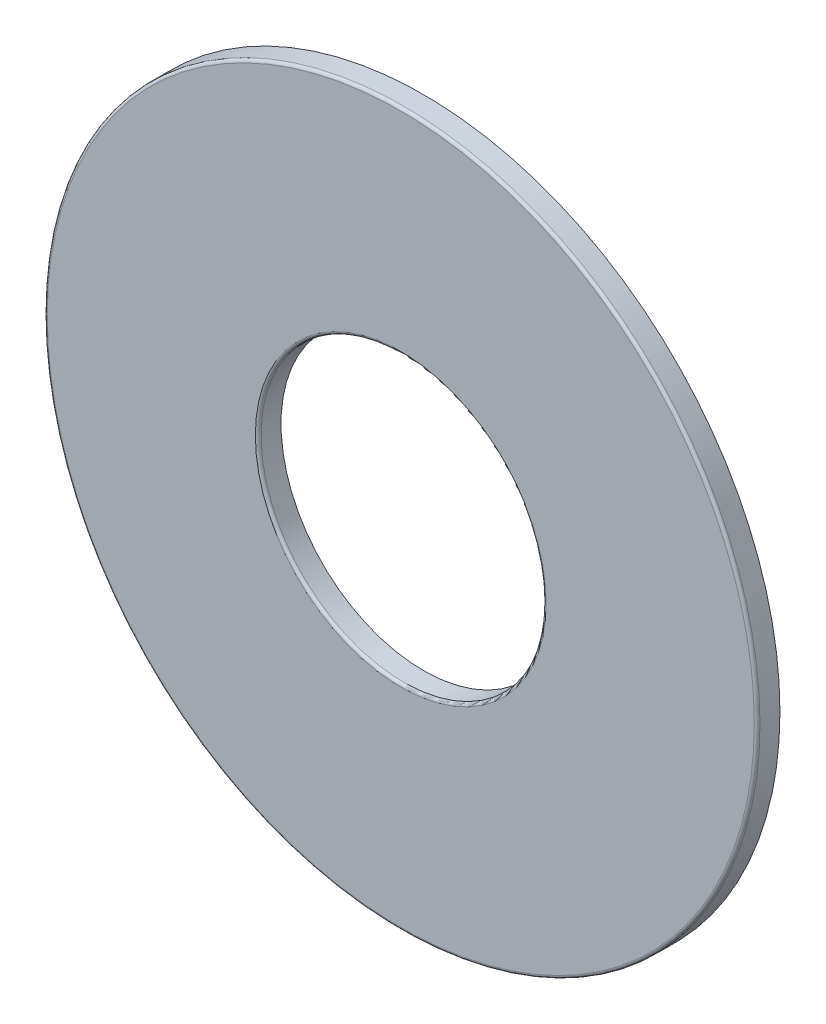
ISO-10303-21;
HEADER;
FILE_DESCRIPTION(('STEP AP214'),'2;1');
FILE_NAME('part.step','',(''),(''),'','','');
FILE_SCHEMA(('AUTOMOTIVE_DESIGN { 1 0 10303 214 1 1 1 1 }'));
ENDSEC;
DATA;
#1=APPLICATION_CONTEXT('core data for automotive mechanical design processes');
#2=APPLICATION_PROTOCOL_DEFINITION('international standard','automotive_design',2000,#1);
#3=PRODUCT_CONTEXT('',#1,'mechanical');
#4=PRODUCT('Part','Part','',(#3));
#5=PRODUCT_RELATED_PRODUCT_CATEGORY('part','',(#4));
#6=PRODUCT_DEFINITION_FORMATION('','',#4);
#7=PRODUCT_DEFINITION_CONTEXT('part definition',#1,'design');
#8=PRODUCT_DEFINITION('design','',#6,#7);
#9=PRODUCT_DEFINITION_SHAPE('','',#8);
#10=(LENGTH_UNIT() NAMED_UNIT(*) SI_UNIT(.MILLI.,.METRE.));
#11=(NAMED_UNIT(*) PLANE_ANGLE_UNIT() SI_UNIT($,.RADIAN.));
#12=(NAMED_UNIT(*) SI_UNIT($,.STERADIAN.) SOLID_ANGLE_UNIT());
#13=UNCERTAINTY_MEASURE_WITH_UNIT(LENGTH_MEASURE(1.E-05),#10,'distance_accuracy_value','');
#14=(GEOMETRIC_REPRESENTATION_CONTEXT(3) GLOBAL_UNCERTAINTY_ASSIGNED_CONTEXT((#13)) GLOBAL_UNIT_ASSIGNED_CONTEXT((#10,
#11,#12)) REPRESENTATION_CONTEXT('',''));
#15=CARTESIAN_POINT('',(0.,0.,0.));
#16=DIRECTION('',(0.,0.,1.));
#17=DIRECTION('',(1.,0.,0.));
#18=AXIS2_PLACEMENT_3D('',#15,#16,#17);
#19=CARTESIAN_POINT('',(0.,0.,0.8));
#20=DIRECTION('',(0.,0.,1.));
#21=DIRECTION('',(1.,0.,0.));
#22=AXIS2_PLACEMENT_3D('',#19,#20,#21);
#23=PLANE('',#22);
#24=CARTESIAN_POINT('',(0.,0.,0.8));
#25=DIRECTION('',(0.,0.,1.));
#26=DIRECTION('',(1.,0.,0.));
#27=AXIS2_PLACEMENT_3D('',#24,#25,#26);
#28=CIRCLE('',#27,12.4);
#29=CARTESIAN_POINT('',(12.4,0.,0.8));
#30=VERTEX_POINT('',#29);
#31=EDGE_CURVE('E42',#30,#30,#28,.T.);
#32=ORIENTED_EDGE('',*,*,#31,.T.);
#33=EDGE_LOOP('',(#32));
#34=FACE_BOUND('',#33,.T.);
#35=CARTESIAN_POINT('',(0.,0.,0.8));
#36=DIRECTION('',(0.,0.,1.));
#37=DIRECTION('',(1.,0.,0.));
#38=AXIS2_PLACEMENT_3D('',#35,#36,#37);
#39=CIRCLE('',#38,5.1);
#40=CARTESIAN_POINT('',(5.1,0.,0.8));
#41=VERTEX_POINT('',#40);
#42=EDGE_CURVE('E46',#41,#41,#39,.F.);
#43=ORIENTED_EDGE('',*,*,#42,.T.);
#44=EDGE_LOOP('',(#43));
#45=FACE_BOUND('',#44,.T.);
#46=ADVANCED_FACE('F31',(#34,#45),#23,.T.);
#47=CARTESIAN_POINT('',(0.,0.,0.));
#48=DIRECTION('',(0.,0.,1.));
#49=DIRECTION('',(1.,0.,0.));
#50=AXIS2_PLACEMENT_3D('',#47,#48,#49);
#51=PLANE('',#50);
#52=CARTESIAN_POINT('',(0.,0.,0.));
#53=DIRECTION('',(0.,0.,1.));
#54=DIRECTION('',(1.,0.,0.));
#55=AXIS2_PLACEMENT_3D('',#52,#53,#54);
#56=CIRCLE('',#55,12.5);
#57=CARTESIAN_POINT('',(12.5,0.,0.));
#58=VERTEX_POINT('',#57);
#59=EDGE_CURVE('E51',#58,#58,#56,.T.);
#60=ORIENTED_EDGE('',*,*,#59,.F.);
#61=EDGE_LOOP('',(#60));
#62=FACE_BOUND('',#61,.T.);
#63=CARTESIAN_POINT('',(0.,0.,0.));
#64=DIRECTION('',(0.,0.,1.));
#65=DIRECTION('',(1.,0.,0.));
#66=AXIS2_PLACEMENT_3D('',#63,#64,#65);
#67=CIRCLE('',#66,5.);
#68=CARTESIAN_POINT('',(5.,0.,0.));
#69=VERTEX_POINT('',#68);
#70=EDGE_CURVE('E54',#69,#69,#67,.T.);
#71=ORIENTED_EDGE('',*,*,#70,.T.);
#72=EDGE_LOOP('',(#71));
#73=FACE_BOUND('',#72,.T.);
#74=ADVANCED_FACE('F58',(#62,#73),#51,.F.);
#75=CARTESIAN_POINT('',(0.,0.,0.8));
#76=DIRECTION('',(0.,0.,-1.));
#77=DIRECTION('',(-1.,0.,0.));
#78=AXIS2_PLACEMENT_3D('',#75,#76,#77);
#79=CYLINDRICAL_SURFACE('',#78,12.5);
#80=CARTESIAN_POINT('',(0.,0.,0.7));
#81=DIRECTION('',(0.,0.,1.));
#82=DIRECTION('',(1.,0.,0.));
#83=AXIS2_PLACEMENT_3D('',#80,#81,#82);
#84=CIRCLE('',#83,12.5);
#85=CARTESIAN_POINT('',(12.5,0.,0.7));
#86=VERTEX_POINT('',#85);
#87=EDGE_CURVE('E38',#86,#86,#84,.F.);
#88=ORIENTED_EDGE('',*,*,#87,.T.);
#89=EDGE_LOOP('',(#88));
#90=FACE_BOUND('',#89,.T.);
#91=ORIENTED_EDGE('',*,*,#59,.T.);
#92=EDGE_LOOP('',(#91));
#93=FACE_BOUND('',#92,.T.);
#94=ADVANCED_FACE('F63',(#90,#93),#79,.T.);
#95=CARTESIAN_POINT('',(0.,0.,0.8));
#96=DIRECTION('',(0.,0.,-1.));
#97=DIRECTION('',(-1.,0.,0.));
#98=AXIS2_PLACEMENT_3D('',#95,#96,#97);
#99=CYLINDRICAL_SURFACE('',#98,5.);
#100=CARTESIAN_POINT('',(0.,0.,0.7));
#101=DIRECTION('',(0.,0.,1.));
#102=DIRECTION('',(1.,0.,0.));
#103=AXIS2_PLACEMENT_3D('',#100,#101,#102);
#104=CIRCLE('',#103,5.);
#105=CARTESIAN_POINT('',(5.,0.,0.7));
#106=VERTEX_POINT('',#105);
#107=EDGE_CURVE('E10',#106,#106,#104,.T.);
#108=ORIENTED_EDGE('',*,*,#107,.T.);
#109=EDGE_LOOP('',(#108));
#110=FACE_BOUND('',#109,.T.);
#111=ORIENTED_EDGE('',*,*,#70,.F.);
#112=EDGE_LOOP('',(#111));
#113=FACE_BOUND('',#112,.T.);
#114=ADVANCED_FACE('F60',(#110,#113),#99,.F.);
#115=CARTESIAN_POINT('',(0.,0.,0.7));
#116=DIRECTION('',(0.,0.,1.));
#117=DIRECTION('',(1.,0.,0.));
#118=AXIS2_PLACEMENT_3D('',#115,#116,#117);
#119=TOROIDAL_SURFACE('',#118,12.4,0.1);
#120=ORIENTED_EDGE('',*,*,#87,.F.);
#121=EDGE_LOOP('',(#120));
#122=FACE_BOUND('',#121,.T.);
#123=ORIENTED_EDGE('',*,*,#31,.F.);
#124=EDGE_LOOP('',(#123));
#125=FACE_BOUND('',#124,.T.);
#126=ADVANCED_FACE('F62',(#122,#125),#119,.T.);
#127=CARTESIAN_POINT('',(0.,0.,0.7));
#128=DIRECTION('',(0.,0.,1.));
#129=DIRECTION('',(1.,0.,0.));
#130=AXIS2_PLACEMENT_3D('',#127,#128,#129);
#131=TOROIDAL_SURFACE('',#130,5.1,0.1);
#132=ORIENTED_EDGE('',*,*,#42,.F.);
#133=EDGE_LOOP('',(#132));
#134=FACE_BOUND('',#133,.T.);
#135=ORIENTED_EDGE('',*,*,#107,.F.);
#136=EDGE_LOOP('',(#135));
#137=FACE_BOUND('',#136,.T.);
#138=ADVANCED_FACE('F33',(#134,#137),#131,.T.);
#139=CLOSED_SHELL('',(#46,#74,#94,#114,#126,#138));
#140=MANIFOLD_SOLID_BREP('B2',#139);
#141=ADVANCED_BREP_SHAPE_REPRESENTATION('',(#18,#140),#14);
#142=SHAPE_DEFINITION_REPRESENTATION(#9,#141);
ENDSEC;
END-ISO-10303-21;
